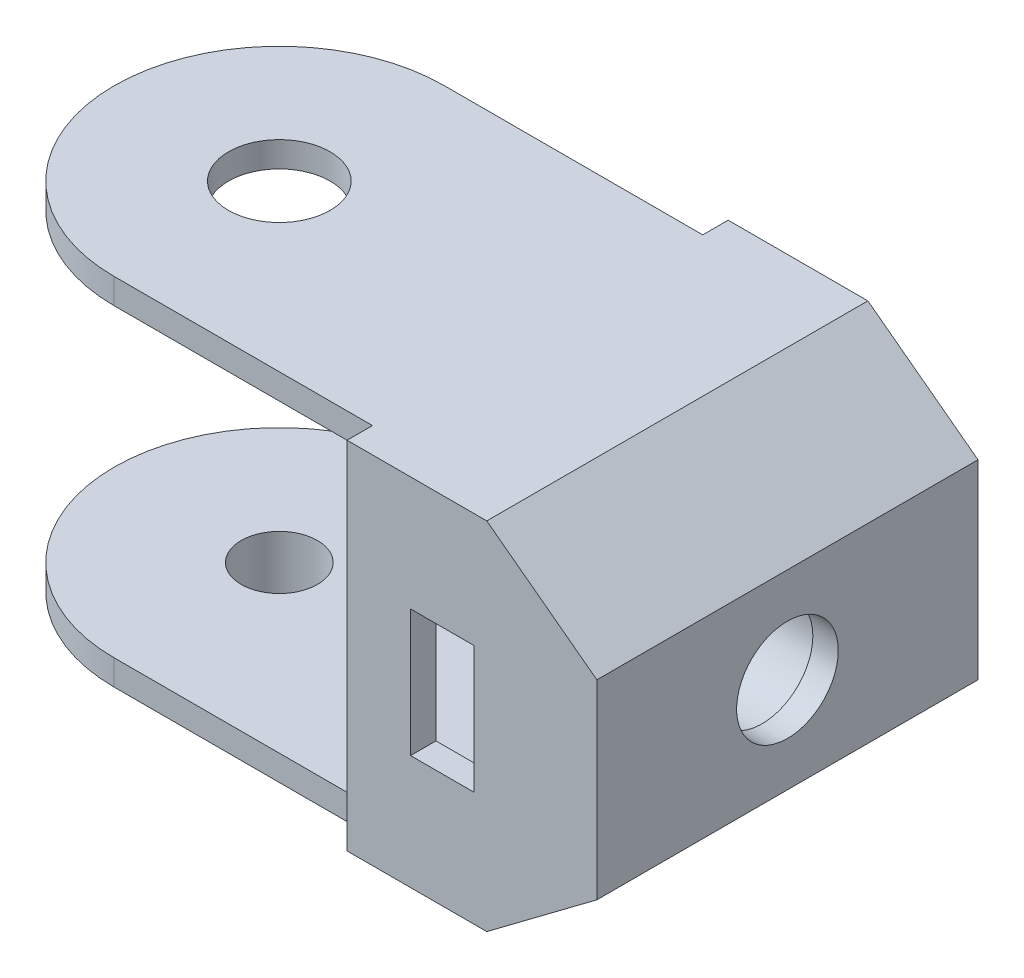
ISO-10303-21;
HEADER;
FILE_DESCRIPTION(('STEP AP214'),'2;1');
FILE_NAME('part.step','',(''),(''),'','','');
FILE_SCHEMA(('AUTOMOTIVE_DESIGN { 1 0 10303 214 1 1 1 1 }'));
ENDSEC;
DATA;
#1=APPLICATION_CONTEXT('core data for automotive mechanical design processes');
#2=APPLICATION_PROTOCOL_DEFINITION('international standard','automotive_design',2000,#1);
#3=PRODUCT_CONTEXT('',#1,'mechanical');
#4=PRODUCT('Part','Part','',(#3));
#5=PRODUCT_RELATED_PRODUCT_CATEGORY('part','',(#4));
#6=PRODUCT_DEFINITION_FORMATION('','',#4);
#7=PRODUCT_DEFINITION_CONTEXT('part definition',#1,'design');
#8=PRODUCT_DEFINITION('design','',#6,#7);
#9=PRODUCT_DEFINITION_SHAPE('','',#8);
#10=(LENGTH_UNIT() NAMED_UNIT(*) SI_UNIT(.MILLI.,.METRE.));
#11=(NAMED_UNIT(*) PLANE_ANGLE_UNIT() SI_UNIT($,.RADIAN.));
#12=(NAMED_UNIT(*) SI_UNIT($,.STERADIAN.) SOLID_ANGLE_UNIT());
#13=UNCERTAINTY_MEASURE_WITH_UNIT(LENGTH_MEASURE(1.E-05),#10,'distance_accuracy_value','');
#14=(GEOMETRIC_REPRESENTATION_CONTEXT(3) GLOBAL_UNCERTAINTY_ASSIGNED_CONTEXT((#13)) GLOBAL_UNIT_ASSIGNED_CONTEXT((#10,
#11,#12)) REPRESENTATION_CONTEXT('',''));
#15=CARTESIAN_POINT('',(0.,0.,0.));
#16=DIRECTION('',(0.,0.,1.));
#17=DIRECTION('',(1.,0.,0.));
#18=AXIS2_PLACEMENT_3D('',#15,#16,#17);
#19=CARTESIAN_POINT('',(0.,0.,0.));
#20=DIRECTION('',(0.,1.,0.));
#21=DIRECTION('',(0.,0.,1.));
#22=AXIS2_PLACEMENT_3D('',#19,#20,#21);
#23=PLANE('',#22);
#24=DIRECTION('',(-1.,0.,0.));
#25=VECTOR('',#24,1.);
#26=CARTESIAN_POINT('',(40.,0.,-13.));
#27=LINE('',#26,#25);
#28=CARTESIAN_POINT('',(20.3333333333333,0.,-13.));
#29=VERTEX_POINT('',#28);
#30=CARTESIAN_POINT('',(0.,0.,-13.));
#31=VERTEX_POINT('',#30);
#32=EDGE_CURVE('E444',#29,#31,#27,.T.);
#33=ORIENTED_EDGE('',*,*,#32,.F.);
#34=DIRECTION('',(0.,0.,1.));
#35=VECTOR('',#34,1.);
#36=CARTESIAN_POINT('',(20.3333333333333,0.,-15.));
#37=LINE('',#36,#35);
#38=CARTESIAN_POINT('',(20.3333333333333,0.,-15.));
#39=VERTEX_POINT('',#38);
#40=EDGE_CURVE('E342',#39,#29,#37,.T.);
#41=ORIENTED_EDGE('',*,*,#40,.F.);
#42=DIRECTION('',(1.,0.,0.));
#43=VECTOR('',#42,1.);
#44=CARTESIAN_POINT('',(20.3333333333333,0.,-15.));
#45=LINE('',#44,#43);
#46=CARTESIAN_POINT('',(31.3333333333333,0.,-15.));
#47=VERTEX_POINT('',#46);
#48=EDGE_CURVE('E325',#39,#47,#45,.T.);
#49=ORIENTED_EDGE('',*,*,#48,.T.);
#50=DIRECTION('',(0.,0.,1.));
#51=VECTOR('',#50,1.);
#52=CARTESIAN_POINT('',(31.3333333333333,0.,-23.8333333333333));
#53=LINE('',#52,#51);
#54=CARTESIAN_POINT('',(31.3333333333333,0.,15.));
#55=VERTEX_POINT('',#54);
#56=EDGE_CURVE('E381',#47,#55,#53,.T.);
#57=ORIENTED_EDGE('',*,*,#56,.T.);
#58=DIRECTION('',(1.,0.,0.));
#59=VECTOR('',#58,1.);
#60=CARTESIAN_POINT('',(20.3333333333333,0.,15.));
#61=LINE('',#60,#59);
#62=CARTESIAN_POINT('',(20.3333333333333,0.,15.));
#63=VERTEX_POINT('',#62);
#64=EDGE_CURVE('E357',#63,#55,#61,.T.);
#65=ORIENTED_EDGE('',*,*,#64,.F.);
#66=DIRECTION('',(0.,0.,-1.));
#67=VECTOR('',#66,1.);
#68=CARTESIAN_POINT('',(20.3333333333333,0.,15.));
#69=LINE('',#68,#67);
#70=CARTESIAN_POINT('',(20.3333333333333,0.,13.));
#71=VERTEX_POINT('',#70);
#72=EDGE_CURVE('E363',#63,#71,#69,.T.);
#73=ORIENTED_EDGE('',*,*,#72,.T.);
#74=DIRECTION('',(1.,0.,0.));
#75=VECTOR('',#74,1.);
#76=CARTESIAN_POINT('',(40.,0.,13.));
#77=LINE('',#76,#75);
#78=CARTESIAN_POINT('',(0.,0.,13.));
#79=VERTEX_POINT('',#78);
#80=EDGE_CURVE('E458',#79,#71,#77,.T.);
#81=ORIENTED_EDGE('',*,*,#80,.F.);
#82=CARTESIAN_POINT('',(0.,0.,0.));
#83=DIRECTION('',(0.,1.,0.));
#84=DIRECTION('',(0.,0.,1.));
#85=AXIS2_PLACEMENT_3D('',#82,#83,#84);
#86=CIRCLE('',#85,13.);
#87=EDGE_CURVE('E456',#31,#79,#86,.T.);
#88=ORIENTED_EDGE('',*,*,#87,.F.);
#89=EDGE_LOOP('',(#33,#41,#49,#57,#65,#73,#81,#88));
#90=FACE_BOUND('',#89,.T.);
#91=CARTESIAN_POINT('',(0.,0.,0.));
#92=DIRECTION('',(0.,1.,0.));
#93=DIRECTION('',(0.,0.,1.));
#94=AXIS2_PLACEMENT_3D('',#91,#92,#93);
#95=CIRCLE('',#94,4.);
#96=CARTESIAN_POINT('',(0.,0.,4.));
#97=VERTEX_POINT('',#96);
#98=EDGE_CURVE('E11',#97,#97,#95,.F.);
#99=ORIENTED_EDGE('',*,*,#98,.F.);
#100=EDGE_LOOP('',(#99));
#101=FACE_BOUND('',#100,.T.);
#102=ADVANCED_FACE('F33',(#90,#101),#23,.F.);
#103=CARTESIAN_POINT('',(38.,26.,-13.));
#104=DIRECTION('',(1.,0.,0.));
#105=DIRECTION('',(0.,0.,-1.));
#106=AXIS2_PLACEMENT_3D('',#103,#104,#105);
#107=PLANE('',#106);
#108=CARTESIAN_POINT('',(38.,14.,0.));
#109=DIRECTION('',(-1.,0.,0.));
#110=DIRECTION('',(0.,0.,1.));
#111=AXIS2_PLACEMENT_3D('',#108,#109,#110);
#112=CIRCLE('',#111,7.51501334518288);
#113=CARTESIAN_POINT('',(38.,7.,2.73412245122206));
#114=VERTEX_POINT('',#113);
#115=CARTESIAN_POINT('',(38.,21.,2.73412245122217));
#116=VERTEX_POINT('',#115);
#117=EDGE_CURVE('E306',#114,#116,#112,.T.);
#118=ORIENTED_EDGE('',*,*,#117,.F.);
#119=DIRECTION('',(0.,0.,1.));
#120=VECTOR('',#119,1.);
#121=CARTESIAN_POINT('',(38.,7.,-13.));
#122=LINE('',#121,#120);
#123=CARTESIAN_POINT('',(38.,7.00000000000001,13.));
#124=VERTEX_POINT('',#123);
#125=EDGE_CURVE('E389',#114,#124,#122,.T.);
#126=ORIENTED_EDGE('',*,*,#125,.T.);
#127=DIRECTION('',(0.,-1.,0.));
#128=VECTOR('',#127,1.);
#129=CARTESIAN_POINT('',(38.,26.,13.));
#130=LINE('',#129,#128);
#131=CARTESIAN_POINT('',(38.,21.,13.));
#132=VERTEX_POINT('',#131);
#133=EDGE_CURVE('E439',#132,#124,#130,.T.);
#134=ORIENTED_EDGE('',*,*,#133,.F.);
#135=DIRECTION('',(0.,0.,-1.));
#136=VECTOR('',#135,1.);
#137=CARTESIAN_POINT('',(38.,21.,-13.));
#138=LINE('',#137,#136);
#139=EDGE_CURVE('E408',#132,#116,#138,.T.);
#140=ORIENTED_EDGE('',*,*,#139,.T.);
#141=EDGE_LOOP('',(#118,#126,#134,#140));
#142=FACE_BOUND('',#141,.T.);
#143=ADVANCED_FACE('F491',(#142),#107,.F.);
#144=CARTESIAN_POINT('',(38.,14.,0.));
#145=DIRECTION('',(1.,0.,0.));
#146=DIRECTION('',(0.,0.,-1.));
#147=AXIS2_PLACEMENT_3D('',#144,#145,#146);
#148=CIRCLE('',#147,4.);
#149=CARTESIAN_POINT('',(38.,14.,-4.));
#150=VERTEX_POINT('',#149);
#151=EDGE_CURVE('E412',#150,#150,#148,.T.);
#152=ORIENTED_EDGE('',*,*,#151,.T.);
#153=EDGE_LOOP('',(#152));
#154=FACE_BOUND('',#153,.T.);
#155=CARTESIAN_POINT('',(38.,14.,0.));
#156=DIRECTION('',(-1.,0.,0.));
#157=DIRECTION('',(0.,0.,1.));
#158=AXIS2_PLACEMENT_3D('',#155,#156,#157);
#159=CIRCLE('',#158,4.48835620975431);
#160=CARTESIAN_POINT('',(38.,14.,4.48835620975432));
#161=VERTEX_POINT('',#160);
#162=EDGE_CURVE('E302',#161,#161,#159,.T.);
#163=ORIENTED_EDGE('',*,*,#162,.T.);
#164=EDGE_LOOP('',(#163));
#165=FACE_BOUND('',#164,.T.);
#166=ADVANCED_FACE('F513',(#154,#165),#107,.F.);
#167=CARTESIAN_POINT('',(40.,2.,-13.));
#168=DIRECTION('',(0.,0.,1.));
#169=DIRECTION('',(1.,0.,0.));
#170=AXIS2_PLACEMENT_3D('',#167,#168,#169);
#171=PLANE('',#170);
#172=DIRECTION('',(-1.,0.,0.));
#173=VECTOR('',#172,1.);
#174=CARTESIAN_POINT('',(40.,28.,-13.));
#175=LINE('',#174,#173);
#176=CARTESIAN_POINT('',(20.3333333333333,28.,-13.));
#177=VERTEX_POINT('',#176);
#178=CARTESIAN_POINT('',(0.,28.,-13.));
#179=VERTEX_POINT('',#178);
#180=EDGE_CURVE('E418',#177,#179,#175,.T.);
#181=ORIENTED_EDGE('',*,*,#180,.F.);
#182=DIRECTION('',(0.,-1.,0.));
#183=VECTOR('',#182,1.);
#184=CARTESIAN_POINT('',(20.3333333333333,28.,-13.));
#185=LINE('',#184,#183);
#186=CARTESIAN_POINT('',(20.3333333333333,26.,-13.));
#187=VERTEX_POINT('',#186);
#188=EDGE_CURVE('E322',#177,#187,#185,.T.);
#189=ORIENTED_EDGE('',*,*,#188,.T.);
#190=DIRECTION('',(-1.,0.,0.));
#191=VECTOR('',#190,1.);
#192=CARTESIAN_POINT('',(40.,26.,-13.));
#193=LINE('',#192,#191);
#194=CARTESIAN_POINT('',(0.,26.,-13.));
#195=VERTEX_POINT('',#194);
#196=EDGE_CURVE('E415',#187,#195,#193,.T.);
#197=ORIENTED_EDGE('',*,*,#196,.T.);
#198=DIRECTION('',(0.,-1.,0.));
#199=VECTOR('',#198,1.);
#200=CARTESIAN_POINT('',(0.,28.,-13.));
#201=LINE('',#200,#199);
#202=EDGE_CURVE('E436',#179,#195,#201,.T.);
#203=ORIENTED_EDGE('',*,*,#202,.F.);
#204=EDGE_LOOP('',(#181,#189,#197,#203));
#205=FACE_BOUND('',#204,.T.);
#206=ADVANCED_FACE('F515',(#205),#171,.F.);
#207=CARTESIAN_POINT('',(40.,2.,13.));
#208=DIRECTION('',(0.,0.,-1.));
#209=DIRECTION('',(-1.,0.,0.));
#210=AXIS2_PLACEMENT_3D('',#207,#208,#209);
#211=PLANE('',#210);
#212=DIRECTION('',(0.,-1.,0.));
#213=VECTOR('',#212,1.);
#214=CARTESIAN_POINT('',(20.3333333333333,28.,13.));
#215=LINE('',#214,#213);
#216=CARTESIAN_POINT('',(20.3333333333333,28.,13.));
#217=VERTEX_POINT('',#216);
#218=CARTESIAN_POINT('',(20.3333333333333,26.,13.));
#219=VERTEX_POINT('',#218);
#220=EDGE_CURVE('E350',#217,#219,#215,.T.);
#221=ORIENTED_EDGE('',*,*,#220,.F.);
#222=DIRECTION('',(1.,0.,0.));
#223=VECTOR('',#222,1.);
#224=CARTESIAN_POINT('',(40.,28.,13.));
#225=LINE('',#224,#223);
#226=CARTESIAN_POINT('',(0.,28.,13.));
#227=VERTEX_POINT('',#226);
#228=EDGE_CURVE('E423',#227,#217,#225,.T.);
#229=ORIENTED_EDGE('',*,*,#228,.F.);
#230=DIRECTION('',(0.,-1.,0.));
#231=VECTOR('',#230,1.);
#232=CARTESIAN_POINT('',(0.,28.,13.));
#233=LINE('',#232,#231);
#234=CARTESIAN_POINT('',(0.,26.,13.));
#235=VERTEX_POINT('',#234);
#236=EDGE_CURVE('E426',#227,#235,#233,.T.);
#237=ORIENTED_EDGE('',*,*,#236,.T.);
#238=DIRECTION('',(1.,0.,0.));
#239=VECTOR('',#238,1.);
#240=CARTESIAN_POINT('',(40.,26.,13.));
#241=LINE('',#240,#239);
#242=EDGE_CURVE('E421',#235,#219,#241,.T.);
#243=ORIENTED_EDGE('',*,*,#242,.T.);
#244=EDGE_LOOP('',(#221,#229,#237,#243));
#245=FACE_BOUND('',#244,.T.);
#246=ADVANCED_FACE('F522',(#245),#211,.F.);
#247=CARTESIAN_POINT('',(20.3333333333333,2.,13.));
#248=VERTEX_POINT('',#247);
#249=EDGE_CURVE('E345',#248,#71,#215,.T.);
#250=ORIENTED_EDGE('',*,*,#249,.F.);
#251=DIRECTION('',(1.,0.,0.));
#252=VECTOR('',#251,1.);
#253=CARTESIAN_POINT('',(40.,2.,13.));
#254=LINE('',#253,#252);
#255=CARTESIAN_POINT('',(0.,2.,13.));
#256=VERTEX_POINT('',#255);
#257=EDGE_CURVE('E451',#256,#248,#254,.T.);
#258=ORIENTED_EDGE('',*,*,#257,.F.);
#259=DIRECTION('',(0.,-1.,0.));
#260=VECTOR('',#259,1.);
#261=CARTESIAN_POINT('',(0.,2.,13.));
#262=LINE('',#261,#260);
#263=EDGE_CURVE('E454',#256,#79,#262,.T.);
#264=ORIENTED_EDGE('',*,*,#263,.T.);
#265=ORIENTED_EDGE('',*,*,#80,.T.);
#266=EDGE_LOOP('',(#250,#258,#264,#265));
#267=FACE_BOUND('',#266,.T.);
#268=ADVANCED_FACE('F529',(#267),#211,.F.);
#269=CARTESIAN_POINT('',(38.,21.,-2.73412245122214));
#270=VERTEX_POINT('',#269);
#271=CARTESIAN_POINT('',(38.,7.,-2.73412245122203));
#272=VERTEX_POINT('',#271);
#273=EDGE_CURVE('E313',#270,#272,#112,.T.);
#274=ORIENTED_EDGE('',*,*,#273,.F.);
#275=CARTESIAN_POINT('',(38.,21.,-13.));
#276=VERTEX_POINT('',#275);
#277=EDGE_CURVE('E402',#270,#276,#138,.T.);
#278=ORIENTED_EDGE('',*,*,#277,.T.);
#279=DIRECTION('',(0.,-1.,0.));
#280=VECTOR('',#279,1.);
#281=CARTESIAN_POINT('',(38.,26.,-13.));
#282=LINE('',#281,#280);
#283=CARTESIAN_POINT('',(38.,7.00000000000001,-13.));
#284=VERTEX_POINT('',#283);
#285=EDGE_CURVE('E442',#276,#284,#282,.T.);
#286=ORIENTED_EDGE('',*,*,#285,.T.);
#287=EDGE_CURVE('E395',#284,#272,#122,.T.);
#288=ORIENTED_EDGE('',*,*,#287,.T.);
#289=EDGE_LOOP('',(#274,#278,#286,#288));
#290=FACE_BOUND('',#289,.T.);
#291=ADVANCED_FACE('F475',(#290),#107,.F.);
#292=CARTESIAN_POINT('',(0.,26.,0.));
#293=DIRECTION('',(0.,1.,0.));
#294=DIRECTION('',(0.,0.,1.));
#295=AXIS2_PLACEMENT_3D('',#292,#293,#294);
#296=PLANE('',#295);
#297=CARTESIAN_POINT('',(0.,26.,0.));
#298=DIRECTION('',(0.,1.,0.));
#299=DIRECTION('',(0.,0.,1.));
#300=AXIS2_PLACEMENT_3D('',#297,#298,#299);
#301=CIRCLE('',#300,4.);
#302=CARTESIAN_POINT('',(0.,26.,4.));
#303=VERTEX_POINT('',#302);
#304=EDGE_CURVE('E296',#303,#303,#301,.T.);
#305=ORIENTED_EDGE('',*,*,#304,.T.);
#306=EDGE_LOOP('',(#305));
#307=FACE_BOUND('',#306,.T.);
#308=CARTESIAN_POINT('',(31.3333333333333,26.,-13.));
#309=VERTEX_POINT('',#308);
#310=EDGE_CURVE('E427',#309,#187,#193,.T.);
#311=ORIENTED_EDGE('',*,*,#310,.F.);
#312=DIRECTION('',(0.,0.,1.));
#313=VECTOR('',#312,1.);
#314=CARTESIAN_POINT('',(31.3333333333333,26.,-25.1392384897534));
#315=LINE('',#314,#313);
#316=CARTESIAN_POINT('',(31.3333333333333,26.,13.));
#317=VERTEX_POINT('',#316);
#318=EDGE_CURVE('E403',#309,#317,#315,.T.);
#319=ORIENTED_EDGE('',*,*,#318,.T.);
#320=DIRECTION('',(1.,0.,0.));
#321=VECTOR('',#320,1.);
#322=CARTESIAN_POINT('',(0.,26.,13.));
#323=LINE('',#322,#321);
#324=EDGE_CURVE('E374',#219,#317,#323,.T.);
#325=ORIENTED_EDGE('',*,*,#324,.F.);
#326=ORIENTED_EDGE('',*,*,#242,.F.);
#327=CARTESIAN_POINT('',(0.,26.,0.));
#328=DIRECTION('',(0.,1.,0.));
#329=DIRECTION('',(0.,0.,1.));
#330=AXIS2_PLACEMENT_3D('',#327,#328,#329);
#331=CIRCLE('',#330,13.);
#332=EDGE_CURVE('E430',#195,#235,#331,.T.);
#333=ORIENTED_EDGE('',*,*,#332,.F.);
#334=ORIENTED_EDGE('',*,*,#196,.F.);
#335=EDGE_LOOP('',(#311,#319,#325,#326,#333,#334));
#336=FACE_BOUND('',#335,.T.);
#337=ADVANCED_FACE('F528',(#307,#336),#296,.F.);
#338=CARTESIAN_POINT('',(40.,2.,-13.));
#339=DIRECTION('',(-1.,0.,0.));
#340=DIRECTION('',(0.,0.,1.));
#341=AXIS2_PLACEMENT_3D('',#338,#339,#340);
#342=PLANE('',#341);
#343=DIRECTION('',(0.,0.,1.));
#344=VECTOR('',#343,1.);
#345=CARTESIAN_POINT('',(40.,21.5,-23.8333333333333));
#346=LINE('',#345,#344);
#347=CARTESIAN_POINT('',(40.,21.5,-15.));
#348=VERTEX_POINT('',#347);
#349=CARTESIAN_POINT('',(40.,21.5,15.));
#350=VERTEX_POINT('',#349);
#351=EDGE_CURVE('E383',#348,#350,#346,.T.);
#352=ORIENTED_EDGE('',*,*,#351,.T.);
#353=DIRECTION('',(0.,1.,0.));
#354=VECTOR('',#353,1.);
#355=CARTESIAN_POINT('',(40.,6.5,15.));
#356=LINE('',#355,#354);
#357=CARTESIAN_POINT('',(40.,6.5,15.));
#358=VERTEX_POINT('',#357);
#359=EDGE_CURVE('E346',#358,#350,#356,.T.);
#360=ORIENTED_EDGE('',*,*,#359,.F.);
#361=DIRECTION('',(0.,0.,1.));
#362=VECTOR('',#361,1.);
#363=CARTESIAN_POINT('',(40.,6.5,-23.8333333333333));
#364=LINE('',#363,#362);
#365=CARTESIAN_POINT('',(40.,6.5,-15.));
#366=VERTEX_POINT('',#365);
#367=EDGE_CURVE('E378',#366,#358,#364,.T.);
#368=ORIENTED_EDGE('',*,*,#367,.F.);
#369=DIRECTION('',(0.,1.,0.));
#370=VECTOR('',#369,1.);
#371=CARTESIAN_POINT('',(40.,6.5,-15.));
#372=LINE('',#371,#370);
#373=EDGE_CURVE('E318',#366,#348,#372,.T.);
#374=ORIENTED_EDGE('',*,*,#373,.T.);
#375=EDGE_LOOP('',(#352,#360,#368,#374));
#376=FACE_BOUND('',#375,.T.);
#377=CARTESIAN_POINT('',(40.,14.,0.));
#378=DIRECTION('',(1.,0.,0.));
#379=DIRECTION('',(0.,0.,-1.));
#380=AXIS2_PLACEMENT_3D('',#377,#378,#379);
#381=CIRCLE('',#380,4.);
#382=CARTESIAN_POINT('',(40.,14.,-4.));
#383=VERTEX_POINT('',#382);
#384=EDGE_CURVE('E411',#383,#383,#381,.T.);
#385=ORIENTED_EDGE('',*,*,#384,.F.);
#386=EDGE_LOOP('',(#385));
#387=FACE_BOUND('',#386,.T.);
#388=ADVANCED_FACE('F35',(#376,#387),#342,.F.);
#389=DIRECTION('',(-1.,0.,0.));
#390=VECTOR('',#389,1.);
#391=CARTESIAN_POINT('',(40.,2.,-13.));
#392=LINE('',#391,#390);
#393=CARTESIAN_POINT('',(20.3333333333333,2.,-13.));
#394=VERTEX_POINT('',#393);
#395=CARTESIAN_POINT('',(0.,2.,-13.));
#396=VERTEX_POINT('',#395);
#397=EDGE_CURVE('E449',#394,#396,#392,.T.);
#398=ORIENTED_EDGE('',*,*,#397,.F.);
#399=EDGE_CURVE('E317',#394,#29,#185,.T.);
#400=ORIENTED_EDGE('',*,*,#399,.T.);
#401=ORIENTED_EDGE('',*,*,#32,.T.);
#402=DIRECTION('',(0.,-1.,0.));
#403=VECTOR('',#402,1.);
#404=CARTESIAN_POINT('',(0.,2.,-13.));
#405=LINE('',#404,#403);
#406=EDGE_CURVE('E462',#396,#31,#405,.T.);
#407=ORIENTED_EDGE('',*,*,#406,.F.);
#408=EDGE_LOOP('',(#398,#400,#401,#407));
#409=FACE_BOUND('',#408,.T.);
#410=ADVANCED_FACE('F524',(#409),#171,.F.);
#411=CARTESIAN_POINT('',(0.,2.,0.));
#412=DIRECTION('',(0.,-1.,0.));
#413=DIRECTION('',(0.,0.,-1.));
#414=AXIS2_PLACEMENT_3D('',#411,#412,#413);
#415=CYLINDRICAL_SURFACE('',#414,13.);
#416=ORIENTED_EDGE('',*,*,#87,.T.);
#417=ORIENTED_EDGE('',*,*,#263,.F.);
#418=CARTESIAN_POINT('',(0.,2.,0.));
#419=DIRECTION('',(0.,1.,0.));
#420=DIRECTION('',(0.,0.,1.));
#421=AXIS2_PLACEMENT_3D('',#418,#419,#420);
#422=CIRCLE('',#421,13.);
#423=EDGE_CURVE('E448',#396,#256,#422,.T.);
#424=ORIENTED_EDGE('',*,*,#423,.F.);
#425=ORIENTED_EDGE('',*,*,#406,.T.);
#426=EDGE_LOOP('',(#416,#417,#424,#425));
#427=FACE_BOUND('',#426,.T.);
#428=ADVANCED_FACE('F542',(#427),#415,.T.);
#429=CARTESIAN_POINT('',(0.,2.,0.));
#430=DIRECTION('',(0.,1.,0.));
#431=DIRECTION('',(0.,0.,1.));
#432=AXIS2_PLACEMENT_3D('',#429,#430,#431);
#433=PLANE('',#432);
#434=CARTESIAN_POINT('',(0.,2.,0.));
#435=DIRECTION('',(0.,1.,0.));
#436=DIRECTION('',(0.,0.,1.));
#437=AXIS2_PLACEMENT_3D('',#434,#435,#436);
#438=CIRCLE('',#437,3.);
#439=CARTESIAN_POINT('',(0.,2.,3.));
#440=VERTEX_POINT('',#439);
#441=EDGE_CURVE('E299',#440,#440,#438,.T.);
#442=ORIENTED_EDGE('',*,*,#441,.F.);
#443=EDGE_LOOP('',(#442));
#444=FACE_BOUND('',#443,.T.);
#445=DIRECTION('',(0.,0.,1.));
#446=VECTOR('',#445,1.);
#447=CARTESIAN_POINT('',(31.3333333333333,2.,-25.1392384897534));
#448=LINE('',#447,#446);
#449=CARTESIAN_POINT('',(31.3333333333333,2.,-13.));
#450=VERTEX_POINT('',#449);
#451=CARTESIAN_POINT('',(31.3333333333333,2.,13.));
#452=VERTEX_POINT('',#451);
#453=EDGE_CURVE('E390',#450,#452,#448,.T.);
#454=ORIENTED_EDGE('',*,*,#453,.F.);
#455=EDGE_CURVE('E445',#450,#394,#392,.T.);
#456=ORIENTED_EDGE('',*,*,#455,.T.);
#457=ORIENTED_EDGE('',*,*,#397,.T.);
#458=ORIENTED_EDGE('',*,*,#423,.T.);
#459=ORIENTED_EDGE('',*,*,#257,.T.);
#460=DIRECTION('',(1.,0.,0.));
#461=VECTOR('',#460,1.);
#462=CARTESIAN_POINT('',(0.,2.,13.));
#463=LINE('',#462,#461);
#464=EDGE_CURVE('E372',#248,#452,#463,.T.);
#465=ORIENTED_EDGE('',*,*,#464,.T.);
#466=EDGE_LOOP('',(#454,#456,#457,#458,#459,#465));
#467=FACE_BOUND('',#466,.T.);
#468=ADVANCED_FACE('F538',(#444,#467),#433,.T.);
#469=CARTESIAN_POINT('',(0.,28.,0.));
#470=DIRECTION('',(0.,-1.,0.));
#471=DIRECTION('',(0.,0.,-1.));
#472=AXIS2_PLACEMENT_3D('',#469,#470,#471);
#473=CYLINDRICAL_SURFACE('',#472,13.);
#474=ORIENTED_EDGE('',*,*,#332,.T.);
#475=ORIENTED_EDGE('',*,*,#236,.F.);
#476=CARTESIAN_POINT('',(0.,28.,0.));
#477=DIRECTION('',(0.,1.,0.));
#478=DIRECTION('',(0.,0.,1.));
#479=AXIS2_PLACEMENT_3D('',#476,#477,#478);
#480=CIRCLE('',#479,13.);
#481=EDGE_CURVE('E420',#179,#227,#480,.T.);
#482=ORIENTED_EDGE('',*,*,#481,.F.);
#483=ORIENTED_EDGE('',*,*,#202,.T.);
#484=EDGE_LOOP('',(#474,#475,#482,#483));
#485=FACE_BOUND('',#484,.T.);
#486=ADVANCED_FACE('F566',(#485),#473,.T.);
#487=CARTESIAN_POINT('',(0.,28.,0.));
#488=DIRECTION('',(0.,1.,0.));
#489=DIRECTION('',(0.,0.,1.));
#490=AXIS2_PLACEMENT_3D('',#487,#488,#489);
#491=PLANE('',#490);
#492=CARTESIAN_POINT('',(0.,28.,0.));
#493=DIRECTION('',(0.,1.,0.));
#494=DIRECTION('',(0.,0.,1.));
#495=AXIS2_PLACEMENT_3D('',#492,#493,#494);
#496=CIRCLE('',#495,4.);
#497=CARTESIAN_POINT('',(0.,28.,4.));
#498=VERTEX_POINT('',#497);
#499=EDGE_CURVE('E293',#498,#498,#496,.T.);
#500=ORIENTED_EDGE('',*,*,#499,.F.);
#501=EDGE_LOOP('',(#500));
#502=FACE_BOUND('',#501,.T.);
#503=DIRECTION('',(0.,0.,1.));
#504=VECTOR('',#503,1.);
#505=CARTESIAN_POINT('',(31.3333333333333,28.,-23.8333333333333));
#506=LINE('',#505,#504);
#507=CARTESIAN_POINT('',(31.3333333333333,28.,-15.));
#508=VERTEX_POINT('',#507);
#509=CARTESIAN_POINT('',(31.3333333333333,28.,15.));
#510=VERTEX_POINT('',#509);
#511=EDGE_CURVE('E377',#508,#510,#506,.T.);
#512=ORIENTED_EDGE('',*,*,#511,.F.);
#513=DIRECTION('',(-1.,0.,0.));
#514=VECTOR('',#513,1.);
#515=CARTESIAN_POINT('',(31.3333333333333,28.,-15.));
#516=LINE('',#515,#514);
#517=CARTESIAN_POINT('',(20.3333333333333,28.,-15.));
#518=VERTEX_POINT('',#517);
#519=EDGE_CURVE('E331',#508,#518,#516,.T.);
#520=ORIENTED_EDGE('',*,*,#519,.T.);
#521=DIRECTION('',(0.,0.,1.));
#522=VECTOR('',#521,1.);
#523=CARTESIAN_POINT('',(20.3333333333333,28.,-15.));
#524=LINE('',#523,#522);
#525=EDGE_CURVE('E337',#518,#177,#524,.T.);
#526=ORIENTED_EDGE('',*,*,#525,.T.);
#527=ORIENTED_EDGE('',*,*,#180,.T.);
#528=ORIENTED_EDGE('',*,*,#481,.T.);
#529=ORIENTED_EDGE('',*,*,#228,.T.);
#530=DIRECTION('',(0.,0.,-1.));
#531=VECTOR('',#530,1.);
#532=CARTESIAN_POINT('',(20.3333333333333,28.,15.));
#533=LINE('',#532,#531);
#534=CARTESIAN_POINT('',(20.3333333333333,28.,15.));
#535=VERTEX_POINT('',#534);
#536=EDGE_CURVE('E369',#535,#217,#533,.T.);
#537=ORIENTED_EDGE('',*,*,#536,.F.);
#538=DIRECTION('',(-1.,0.,0.));
#539=VECTOR('',#538,1.);
#540=CARTESIAN_POINT('',(31.3333333333333,28.,15.));
#541=LINE('',#540,#539);
#542=EDGE_CURVE('E353',#510,#535,#541,.T.);
#543=ORIENTED_EDGE('',*,*,#542,.F.);
#544=EDGE_LOOP('',(#512,#520,#526,#527,#528,#529,#537,#543));
#545=FACE_BOUND('',#544,.T.);
#546=ADVANCED_FACE('F570',(#502,#545),#491,.T.);
#547=CARTESIAN_POINT('',(38.,14.,0.));
#548=DIRECTION('',(1.,0.,0.));
#549=DIRECTION('',(0.,0.,-1.));
#550=AXIS2_PLACEMENT_3D('',#547,#548,#549);
#551=CYLINDRICAL_SURFACE('',#550,4.);
#552=ORIENTED_EDGE('',*,*,#151,.F.);
#553=EDGE_LOOP('',(#552));
#554=FACE_BOUND('',#553,.T.);
#555=ORIENTED_EDGE('',*,*,#384,.T.);
#556=EDGE_LOOP('',(#555));
#557=FACE_BOUND('',#556,.T.);
#558=ADVANCED_FACE('F602',(#554,#557),#551,.F.);
#559=CARTESIAN_POINT('',(31.3333333333333,26.,-25.1392384897534));
#560=DIRECTION('',(-0.6,-0.8,0.));
#561=DIRECTION('',(0.8,-0.6,0.));
#562=AXIS2_PLACEMENT_3D('',#559,#560,#561);
#563=PLANE('',#562);
#564=ORIENTED_EDGE('',*,*,#277,.F.);
#565=CARTESIAN_POINT('',(47.3333333333333,14.,0.));
#566=DIRECTION('',(-0.6,-0.8,0.));
#567=DIRECTION('',(0.8,-0.6,0.));
#568=AXIS2_PLACEMENT_3D('',#565,#566,#567);
#569=ELLIPSE('',#568,12.5250222419715,7.51501334518288);
#570=EDGE_CURVE('E312',#270,#116,#569,.F.);
#571=ORIENTED_EDGE('',*,*,#570,.T.);
#572=ORIENTED_EDGE('',*,*,#139,.F.);
#573=DIRECTION('',(0.8,-0.6,0.));
#574=VECTOR('',#573,1.);
#575=CARTESIAN_POINT('',(31.3333333333333,26.,13.));
#576=LINE('',#575,#574);
#577=EDGE_CURVE('E398',#317,#132,#576,.T.);
#578=ORIENTED_EDGE('',*,*,#577,.F.);
#579=ORIENTED_EDGE('',*,*,#318,.F.);
#580=DIRECTION('',(-0.8,0.6,0.));
#581=VECTOR('',#580,1.);
#582=CARTESIAN_POINT('',(31.3333333333333,26.,-13.));
#583=LINE('',#582,#581);
#584=EDGE_CURVE('E399',#276,#309,#583,.T.);
#585=ORIENTED_EDGE('',*,*,#584,.F.);
#586=EDGE_LOOP('',(#564,#571,#572,#578,#579,#585));
#587=FACE_BOUND('',#586,.T.);
#588=ADVANCED_FACE('F493',(#587),#563,.T.);
#589=CARTESIAN_POINT('',(34.,26.,-25.1392384897534));
#590=DIRECTION('',(0.600000000000001,0.799999999999999,0.));
#591=DIRECTION('',(-0.799999999999999,0.600000000000001,0.));
#592=AXIS2_PLACEMENT_3D('',#589,#590,#591);
#593=PLANE('',#592);
#594=ORIENTED_EDGE('',*,*,#511,.T.);
#595=DIRECTION('',(-0.8,0.6,0.));
#596=VECTOR('',#595,1.);
#597=CARTESIAN_POINT('',(40.,21.5,15.));
#598=LINE('',#597,#596);
#599=EDGE_CURVE('E349',#350,#510,#598,.T.);
#600=ORIENTED_EDGE('',*,*,#599,.F.);
#601=ORIENTED_EDGE('',*,*,#351,.F.);
#602=DIRECTION('',(-0.8,0.6,0.));
#603=VECTOR('',#602,1.);
#604=CARTESIAN_POINT('',(40.,21.5,-15.));
#605=LINE('',#604,#603);
#606=EDGE_CURVE('E334',#348,#508,#605,.T.);
#607=ORIENTED_EDGE('',*,*,#606,.T.);
#608=EDGE_LOOP('',(#594,#600,#601,#607));
#609=FACE_BOUND('',#608,.T.);
#610=ADVANCED_FACE('F595',(#609),#593,.T.);
#611=CARTESIAN_POINT('',(31.3333333333333,2.,-25.1392384897534));
#612=DIRECTION('',(-0.6,0.8,0.));
#613=DIRECTION('',(-0.8,-0.6,0.));
#614=AXIS2_PLACEMENT_3D('',#611,#612,#613);
#615=PLANE('',#614);
#616=ORIENTED_EDGE('',*,*,#125,.F.);
#617=CARTESIAN_POINT('',(47.3333333333333,14.,0.));
#618=DIRECTION('',(-0.6,0.8,0.));
#619=DIRECTION('',(0.8,0.6,0.));
#620=AXIS2_PLACEMENT_3D('',#617,#618,#619);
#621=ELLIPSE('',#620,12.5250222419715,7.51501334518288);
#622=EDGE_CURVE('E41',#114,#272,#621,.F.);
#623=ORIENTED_EDGE('',*,*,#622,.T.);
#624=ORIENTED_EDGE('',*,*,#287,.F.);
#625=DIRECTION('',(0.8,0.6,0.));
#626=VECTOR('',#625,1.);
#627=CARTESIAN_POINT('',(31.3333333333333,2.,-13.));
#628=LINE('',#627,#626);
#629=EDGE_CURVE('E386',#450,#284,#628,.T.);
#630=ORIENTED_EDGE('',*,*,#629,.F.);
#631=ORIENTED_EDGE('',*,*,#453,.T.);
#632=DIRECTION('',(-0.8,-0.6,0.));
#633=VECTOR('',#632,1.);
#634=CARTESIAN_POINT('',(31.3333333333333,2.,13.));
#635=LINE('',#634,#633);
#636=EDGE_CURVE('E380',#124,#452,#635,.T.);
#637=ORIENTED_EDGE('',*,*,#636,.F.);
#638=EDGE_LOOP('',(#616,#623,#624,#630,#631,#637));
#639=FACE_BOUND('',#638,.T.);
#640=ADVANCED_FACE('F468',(#639),#615,.T.);
#641=CARTESIAN_POINT('',(38.,5.,-25.1392384897534));
#642=DIRECTION('',(0.6,-0.8,0.));
#643=DIRECTION('',(0.8,0.6,0.));
#644=AXIS2_PLACEMENT_3D('',#641,#642,#643);
#645=PLANE('',#644);
#646=ORIENTED_EDGE('',*,*,#56,.F.);
#647=DIRECTION('',(0.8,0.6,0.));
#648=VECTOR('',#647,1.);
#649=CARTESIAN_POINT('',(31.3333333333333,0.,-15.));
#650=LINE('',#649,#648);
#651=EDGE_CURVE('E321',#47,#366,#650,.T.);
#652=ORIENTED_EDGE('',*,*,#651,.T.);
#653=ORIENTED_EDGE('',*,*,#367,.T.);
#654=DIRECTION('',(0.8,0.6,0.));
#655=VECTOR('',#654,1.);
#656=CARTESIAN_POINT('',(31.3333333333333,0.,15.));
#657=LINE('',#656,#655);
#658=EDGE_CURVE('E360',#55,#358,#657,.T.);
#659=ORIENTED_EDGE('',*,*,#658,.F.);
#660=EDGE_LOOP('',(#646,#652,#653,#659));
#661=FACE_BOUND('',#660,.T.);
#662=ADVANCED_FACE('F597',(#661),#645,.T.);
#663=CARTESIAN_POINT('',(0.,0.,13.));
#664=DIRECTION('',(0.,0.,1.));
#665=DIRECTION('',(1.,0.,0.));
#666=AXIS2_PLACEMENT_3D('',#663,#664,#665);
#667=PLANE('',#666);
#668=DIRECTION('',(-1.,0.,0.));
#669=VECTOR('',#668,1.);
#670=CARTESIAN_POINT('',(0.,19.,13.));
#671=LINE('',#670,#669);
#672=CARTESIAN_POINT('',(30.3333333333333,19.,13.));
#673=VERTEX_POINT('',#672);
#674=CARTESIAN_POINT('',(25.3333333333333,19.,13.));
#675=VERTEX_POINT('',#674);
#676=EDGE_CURVE('E281',#673,#675,#671,.T.);
#677=ORIENTED_EDGE('',*,*,#676,.T.);
#678=DIRECTION('',(0.,-1.,0.));
#679=VECTOR('',#678,1.);
#680=CARTESIAN_POINT('',(25.3333333333333,0.,13.));
#681=LINE('',#680,#679);
#682=CARTESIAN_POINT('',(25.3333333333333,9.,13.));
#683=VERTEX_POINT('',#682);
#684=EDGE_CURVE('E284',#675,#683,#681,.T.);
#685=ORIENTED_EDGE('',*,*,#684,.T.);
#686=DIRECTION('',(1.,0.,0.));
#687=VECTOR('',#686,1.);
#688=CARTESIAN_POINT('',(0.,8.99999999999999,13.));
#689=LINE('',#688,#687);
#690=CARTESIAN_POINT('',(30.3333333333333,9.,13.));
#691=VERTEX_POINT('',#690);
#692=EDGE_CURVE('E269',#683,#691,#689,.T.);
#693=ORIENTED_EDGE('',*,*,#692,.T.);
#694=DIRECTION('',(0.,1.,0.));
#695=VECTOR('',#694,1.);
#696=CARTESIAN_POINT('',(30.3333333333333,0.,13.));
#697=LINE('',#696,#695);
#698=EDGE_CURVE('E278',#691,#673,#697,.T.);
#699=ORIENTED_EDGE('',*,*,#698,.T.);
#700=EDGE_LOOP('',(#677,#685,#693,#699));
#701=FACE_BOUND('',#700,.T.);
#702=EDGE_CURVE('E366',#219,#248,#215,.T.);
#703=ORIENTED_EDGE('',*,*,#702,.F.);
#704=ORIENTED_EDGE('',*,*,#324,.T.);
#705=ORIENTED_EDGE('',*,*,#577,.T.);
#706=ORIENTED_EDGE('',*,*,#133,.T.);
#707=ORIENTED_EDGE('',*,*,#636,.T.);
#708=ORIENTED_EDGE('',*,*,#464,.F.);
#709=EDGE_LOOP('',(#703,#704,#705,#706,#707,#708));
#710=FACE_BOUND('',#709,.T.);
#711=ADVANCED_FACE('F487',(#701,#710),#667,.F.);
#712=CARTESIAN_POINT('',(20.3333333333333,28.,15.));
#713=DIRECTION('',(1.,0.,0.));
#714=DIRECTION('',(0.,1.,0.));
#715=AXIS2_PLACEMENT_3D('',#712,#713,#714);
#716=PLANE('',#715);
#717=ORIENTED_EDGE('',*,*,#220,.T.);
#718=ORIENTED_EDGE('',*,*,#702,.T.);
#719=ORIENTED_EDGE('',*,*,#249,.T.);
#720=ORIENTED_EDGE('',*,*,#72,.F.);
#721=DIRECTION('',(0.,-1.,0.));
#722=VECTOR('',#721,1.);
#723=CARTESIAN_POINT('',(20.3333333333333,28.,15.));
#724=LINE('',#723,#722);
#725=EDGE_CURVE('E355',#535,#63,#724,.T.);
#726=ORIENTED_EDGE('',*,*,#725,.F.);
#727=ORIENTED_EDGE('',*,*,#536,.T.);
#728=EDGE_LOOP('',(#717,#718,#719,#720,#726,#727));
#729=FACE_BOUND('',#728,.T.);
#730=ADVANCED_FACE('F587',(#729),#716,.F.);
#731=CARTESIAN_POINT('',(0.,0.,15.));
#732=DIRECTION('',(0.,0.,1.));
#733=DIRECTION('',(1.,0.,0.));
#734=AXIS2_PLACEMENT_3D('',#731,#732,#733);
#735=PLANE('',#734);
#736=DIRECTION('',(0.,-1.,0.));
#737=VECTOR('',#736,1.);
#738=CARTESIAN_POINT('',(25.3333333333333,19.,15.));
#739=LINE('',#738,#737);
#740=CARTESIAN_POINT('',(25.3333333333333,19.,15.));
#741=VERTEX_POINT('',#740);
#742=CARTESIAN_POINT('',(25.3333333333333,9.,15.));
#743=VERTEX_POINT('',#742);
#744=EDGE_CURVE('E255',#741,#743,#739,.T.);
#745=ORIENTED_EDGE('',*,*,#744,.F.);
#746=DIRECTION('',(-1.,0.,0.));
#747=VECTOR('',#746,1.);
#748=CARTESIAN_POINT('',(25.3333333333333,19.,15.));
#749=LINE('',#748,#747);
#750=CARTESIAN_POINT('',(30.3333333333333,19.,15.));
#751=VERTEX_POINT('',#750);
#752=EDGE_CURVE('E263',#751,#741,#749,.T.);
#753=ORIENTED_EDGE('',*,*,#752,.F.);
#754=DIRECTION('',(0.,1.,0.));
#755=VECTOR('',#754,1.);
#756=CARTESIAN_POINT('',(30.3333333333333,19.,15.));
#757=LINE('',#756,#755);
#758=CARTESIAN_POINT('',(30.3333333333333,9.,15.));
#759=VERTEX_POINT('',#758);
#760=EDGE_CURVE('E260',#759,#751,#757,.T.);
#761=ORIENTED_EDGE('',*,*,#760,.F.);
#762=DIRECTION('',(1.,0.,0.));
#763=VECTOR('',#762,1.);
#764=CARTESIAN_POINT('',(25.3333333333333,9.,15.));
#765=LINE('',#764,#763);
#766=EDGE_CURVE('E257',#743,#759,#765,.T.);
#767=ORIENTED_EDGE('',*,*,#766,.F.);
#768=EDGE_LOOP('',(#745,#753,#761,#767));
#769=FACE_BOUND('',#768,.T.);
#770=ORIENTED_EDGE('',*,*,#359,.T.);
#771=ORIENTED_EDGE('',*,*,#599,.T.);
#772=ORIENTED_EDGE('',*,*,#542,.T.);
#773=ORIENTED_EDGE('',*,*,#725,.T.);
#774=ORIENTED_EDGE('',*,*,#64,.T.);
#775=ORIENTED_EDGE('',*,*,#658,.T.);
#776=EDGE_LOOP('',(#770,#771,#772,#773,#774,#775));
#777=FACE_BOUND('',#776,.T.);
#778=ADVANCED_FACE('F591',(#769,#777),#735,.T.);
#779=CARTESIAN_POINT('',(0.,0.,-13.));
#780=DIRECTION('',(0.,0.,-1.));
#781=DIRECTION('',(1.,0.,0.));
#782=AXIS2_PLACEMENT_3D('',#779,#780,#781);
#783=PLANE('',#782);
#784=DIRECTION('',(1.,0.,0.));
#785=VECTOR('',#784,1.);
#786=CARTESIAN_POINT('',(0.,19.,-13.));
#787=LINE('',#786,#785);
#788=CARTESIAN_POINT('',(25.3333333333333,19.,-13.));
#789=VERTEX_POINT('',#788);
#790=CARTESIAN_POINT('',(30.3333333333333,19.,-13.));
#791=VERTEX_POINT('',#790);
#792=EDGE_CURVE('E249',#789,#791,#787,.T.);
#793=ORIENTED_EDGE('',*,*,#792,.T.);
#794=DIRECTION('',(0.,-1.,0.));
#795=VECTOR('',#794,1.);
#796=CARTESIAN_POINT('',(30.3333333333333,0.,-13.));
#797=LINE('',#796,#795);
#798=CARTESIAN_POINT('',(30.3333333333333,9.,-13.));
#799=VERTEX_POINT('',#798);
#800=EDGE_CURVE('E252',#791,#799,#797,.T.);
#801=ORIENTED_EDGE('',*,*,#800,.T.);
#802=DIRECTION('',(-1.,0.,0.));
#803=VECTOR('',#802,1.);
#804=CARTESIAN_POINT('',(0.,9.,-13.));
#805=LINE('',#804,#803);
#806=CARTESIAN_POINT('',(25.3333333333333,9.,-13.));
#807=VERTEX_POINT('',#806);
#808=EDGE_CURVE('E244',#799,#807,#805,.T.);
#809=ORIENTED_EDGE('',*,*,#808,.T.);
#810=DIRECTION('',(0.,1.,0.));
#811=VECTOR('',#810,1.);
#812=CARTESIAN_POINT('',(25.3333333333333,0.,-13.));
#813=LINE('',#812,#811);
#814=EDGE_CURVE('E224',#807,#789,#813,.T.);
#815=ORIENTED_EDGE('',*,*,#814,.T.);
#816=EDGE_LOOP('',(#793,#801,#809,#815));
#817=FACE_BOUND('',#816,.T.);
#818=ORIENTED_EDGE('',*,*,#584,.T.);
#819=ORIENTED_EDGE('',*,*,#310,.T.);
#820=EDGE_CURVE('E339',#187,#394,#185,.T.);
#821=ORIENTED_EDGE('',*,*,#820,.T.);
#822=ORIENTED_EDGE('',*,*,#455,.F.);
#823=ORIENTED_EDGE('',*,*,#629,.T.);
#824=ORIENTED_EDGE('',*,*,#285,.F.);
#825=EDGE_LOOP('',(#818,#819,#821,#822,#823,#824));
#826=FACE_BOUND('',#825,.T.);
#827=ADVANCED_FACE('F480',(#817,#826),#783,.F.);
#828=CARTESIAN_POINT('',(20.3333333333333,28.,-15.));
#829=DIRECTION('',(-1.,0.,0.));
#830=DIRECTION('',(0.,-1.,0.));
#831=AXIS2_PLACEMENT_3D('',#828,#829,#830);
#832=PLANE('',#831);
#833=ORIENTED_EDGE('',*,*,#188,.F.);
#834=ORIENTED_EDGE('',*,*,#525,.F.);
#835=DIRECTION('',(0.,-1.,0.));
#836=VECTOR('',#835,1.);
#837=CARTESIAN_POINT('',(20.3333333333333,28.,-15.));
#838=LINE('',#837,#836);
#839=EDGE_CURVE('E328',#518,#39,#838,.T.);
#840=ORIENTED_EDGE('',*,*,#839,.T.);
#841=ORIENTED_EDGE('',*,*,#40,.T.);
#842=ORIENTED_EDGE('',*,*,#399,.F.);
#843=ORIENTED_EDGE('',*,*,#820,.F.);
#844=EDGE_LOOP('',(#833,#834,#840,#841,#842,#843));
#845=FACE_BOUND('',#844,.T.);
#846=ADVANCED_FACE('F557',(#845),#832,.T.);
#847=CARTESIAN_POINT('',(0.,0.,-15.));
#848=DIRECTION('',(0.,0.,-1.));
#849=DIRECTION('',(1.,0.,0.));
#850=AXIS2_PLACEMENT_3D('',#847,#848,#849);
#851=PLANE('',#850);
#852=DIRECTION('',(0.,-1.,0.));
#853=VECTOR('',#852,1.);
#854=CARTESIAN_POINT('',(30.3333333333333,19.,-15.));
#855=LINE('',#854,#853);
#856=CARTESIAN_POINT('',(30.3333333333333,19.,-15.));
#857=VERTEX_POINT('',#856);
#858=CARTESIAN_POINT('',(30.3333333333333,9.,-15.));
#859=VERTEX_POINT('',#858);
#860=EDGE_CURVE('E56',#857,#859,#855,.T.);
#861=ORIENTED_EDGE('',*,*,#860,.F.);
#862=DIRECTION('',(1.,0.,0.));
#863=VECTOR('',#862,1.);
#864=CARTESIAN_POINT('',(30.3333333333333,19.,-15.));
#865=LINE('',#864,#863);
#866=CARTESIAN_POINT('',(25.3333333333333,19.,-15.));
#867=VERTEX_POINT('',#866);
#868=EDGE_CURVE('E237',#867,#857,#865,.T.);
#869=ORIENTED_EDGE('',*,*,#868,.F.);
#870=DIRECTION('',(0.,1.,0.));
#871=VECTOR('',#870,1.);
#872=CARTESIAN_POINT('',(25.3333333333333,19.,-15.));
#873=LINE('',#872,#871);
#874=CARTESIAN_POINT('',(25.3333333333333,9.,-15.));
#875=VERTEX_POINT('',#874);
#876=EDGE_CURVE('E221',#875,#867,#873,.T.);
#877=ORIENTED_EDGE('',*,*,#876,.F.);
#878=DIRECTION('',(-1.,0.,0.));
#879=VECTOR('',#878,1.);
#880=CARTESIAN_POINT('',(30.3333333333333,9.,-15.));
#881=LINE('',#880,#879);
#882=EDGE_CURVE('E230',#859,#875,#881,.T.);
#883=ORIENTED_EDGE('',*,*,#882,.F.);
#884=EDGE_LOOP('',(#861,#869,#877,#883));
#885=FACE_BOUND('',#884,.T.);
#886=ORIENTED_EDGE('',*,*,#373,.F.);
#887=ORIENTED_EDGE('',*,*,#651,.F.);
#888=ORIENTED_EDGE('',*,*,#48,.F.);
#889=ORIENTED_EDGE('',*,*,#839,.F.);
#890=ORIENTED_EDGE('',*,*,#519,.F.);
#891=ORIENTED_EDGE('',*,*,#606,.F.);
#892=EDGE_LOOP('',(#886,#887,#888,#889,#890,#891));
#893=FACE_BOUND('',#892,.T.);
#894=ADVANCED_FACE('F234',(#885,#893),#851,.T.);
#895=CARTESIAN_POINT('',(34.,14.,0.));
#896=DIRECTION('',(-1.,0.,0.));
#897=DIRECTION('',(0.,0.,1.));
#898=AXIS2_PLACEMENT_3D('',#895,#896,#897);
#899=PLANE('',#898);
#900=CARTESIAN_POINT('',(34.,14.,0.));
#901=DIRECTION('',(-1.,0.,0.));
#902=DIRECTION('',(0.,0.,1.));
#903=AXIS2_PLACEMENT_3D('',#900,#901,#902);
#904=CIRCLE('',#903,7.51501334518288);
#905=CARTESIAN_POINT('',(34.,14.,7.51501334518289));
#906=VERTEX_POINT('',#905);
#907=EDGE_CURVE('E309',#906,#906,#904,.T.);
#908=ORIENTED_EDGE('',*,*,#907,.T.);
#909=EDGE_LOOP('',(#908));
#910=FACE_BOUND('',#909,.T.);
#911=CARTESIAN_POINT('',(34.,14.,0.));
#912=DIRECTION('',(-1.,0.,0.));
#913=DIRECTION('',(0.,0.,1.));
#914=AXIS2_PLACEMENT_3D('',#911,#912,#913);
#915=CIRCLE('',#914,4.48835620975431);
#916=CARTESIAN_POINT('',(34.,14.,4.48835620975432));
#917=VERTEX_POINT('',#916);
#918=EDGE_CURVE('E303',#917,#917,#915,.T.);
#919=ORIENTED_EDGE('',*,*,#918,.F.);
#920=EDGE_LOOP('',(#919));
#921=FACE_BOUND('',#920,.T.);
#922=ADVANCED_FACE('F498',(#910,#921),#899,.T.);
#923=CARTESIAN_POINT('',(34.,14.,0.));
#924=DIRECTION('',(1.,0.,0.));
#925=DIRECTION('',(0.,0.,-1.));
#926=AXIS2_PLACEMENT_3D('',#923,#924,#925);
#927=CYLINDRICAL_SURFACE('',#926,7.51501334518288);
#928=ORIENTED_EDGE('',*,*,#570,.F.);
#929=ORIENTED_EDGE('',*,*,#273,.T.);
#930=ORIENTED_EDGE('',*,*,#622,.F.);
#931=ORIENTED_EDGE('',*,*,#117,.T.);
#932=EDGE_LOOP('',(#928,#929,#930,#931));
#933=FACE_BOUND('',#932,.T.);
#934=ORIENTED_EDGE('',*,*,#907,.F.);
#935=EDGE_LOOP('',(#934));
#936=FACE_BOUND('',#935,.T.);
#937=ADVANCED_FACE('F494',(#933,#936),#927,.T.);
#938=CARTESIAN_POINT('',(34.,14.,0.));
#939=DIRECTION('',(1.,0.,0.));
#940=DIRECTION('',(0.,0.,-1.));
#941=AXIS2_PLACEMENT_3D('',#938,#939,#940);
#942=CYLINDRICAL_SURFACE('',#941,4.48835620975431);
#943=ORIENTED_EDGE('',*,*,#918,.T.);
#944=EDGE_LOOP('',(#943));
#945=FACE_BOUND('',#944,.T.);
#946=ORIENTED_EDGE('',*,*,#162,.F.);
#947=EDGE_LOOP('',(#946));
#948=FACE_BOUND('',#947,.T.);
#949=ADVANCED_FACE('F497',(#945,#948),#942,.F.);
#950=CARTESIAN_POINT('',(0.,10.,0.));
#951=DIRECTION('',(0.,-1.,0.));
#952=DIRECTION('',(0.,0.,-1.));
#953=AXIS2_PLACEMENT_3D('',#950,#951,#952);
#954=CYLINDRICAL_SURFACE('',#953,3.);
#955=ORIENTED_EDGE('',*,*,#441,.T.);
#956=EDGE_LOOP('',(#955));
#957=FACE_BOUND('',#956,.T.);
#958=CARTESIAN_POINT('',(0.,-7.,0.));
#959=DIRECTION('',(0.,-1.,0.));
#960=DIRECTION('',(0.,0.,-1.));
#961=AXIS2_PLACEMENT_3D('',#958,#959,#960);
#962=CIRCLE('',#961,3.);
#963=CARTESIAN_POINT('',(0.,-7.,-3.));
#964=VERTEX_POINT('',#963);
#965=EDGE_CURVE('E290',#964,#964,#962,.T.);
#966=ORIENTED_EDGE('',*,*,#965,.T.);
#967=EDGE_LOOP('',(#966));
#968=FACE_BOUND('',#967,.T.);
#969=ADVANCED_FACE('F509',(#957,#968),#954,.F.);
#970=CARTESIAN_POINT('',(0.,18.,0.));
#971=DIRECTION('',(0.,1.,0.));
#972=DIRECTION('',(0.,0.,1.));
#973=AXIS2_PLACEMENT_3D('',#970,#971,#972);
#974=CYLINDRICAL_SURFACE('',#973,4.);
#975=ORIENTED_EDGE('',*,*,#499,.T.);
#976=EDGE_LOOP('',(#975));
#977=FACE_BOUND('',#976,.T.);
#978=ORIENTED_EDGE('',*,*,#304,.F.);
#979=EDGE_LOOP('',(#978));
#980=FACE_BOUND('',#979,.T.);
#981=ADVANCED_FACE('F629',(#977,#980),#974,.F.);
#982=CARTESIAN_POINT('',(0.,-7.,0.));
#983=DIRECTION('',(0.,1.,0.));
#984=DIRECTION('',(0.,0.,1.));
#985=AXIS2_PLACEMENT_3D('',#982,#983,#984);
#986=CYLINDRICAL_SURFACE('',#985,4.);
#987=ORIENTED_EDGE('',*,*,#98,.T.);
#988=EDGE_LOOP('',(#987));
#989=FACE_BOUND('',#988,.T.);
#990=CARTESIAN_POINT('',(0.,-8.,0.));
#991=DIRECTION('',(0.,-1.,0.));
#992=DIRECTION('',(0.,0.,-1.));
#993=AXIS2_PLACEMENT_3D('',#990,#991,#992);
#994=CIRCLE('',#993,4.);
#995=CARTESIAN_POINT('',(0.,-8.,-4.));
#996=VERTEX_POINT('',#995);
#997=EDGE_CURVE('E287',#996,#996,#994,.T.);
#998=ORIENTED_EDGE('',*,*,#997,.F.);
#999=EDGE_LOOP('',(#998));
#1000=FACE_BOUND('',#999,.T.);
#1001=ADVANCED_FACE('F636',(#989,#1000),#986,.T.);
#1002=CARTESIAN_POINT('',(0.,-7.,0.));
#1003=DIRECTION('',(0.,-1.,0.));
#1004=DIRECTION('',(0.,0.,-1.));
#1005=AXIS2_PLACEMENT_3D('',#1002,#1003,#1004);
#1006=PLANE('',#1005);
#1007=ORIENTED_EDGE('',*,*,#965,.F.);
#1008=EDGE_LOOP('',(#1007));
#1009=FACE_BOUND('',#1008,.T.);
#1010=ADVANCED_FACE('F633',(#1009),#1006,.F.);
#1011=CARTESIAN_POINT('',(0.,-8.,0.));
#1012=DIRECTION('',(0.,-1.,0.));
#1013=DIRECTION('',(0.,0.,-1.));
#1014=AXIS2_PLACEMENT_3D('',#1011,#1012,#1013);
#1015=PLANE('',#1014);
#1016=ORIENTED_EDGE('',*,*,#997,.T.);
#1017=EDGE_LOOP('',(#1016));
#1018=FACE_BOUND('',#1017,.T.);
#1019=ADVANCED_FACE('F635',(#1018),#1015,.T.);
#1020=CARTESIAN_POINT('',(25.3333333333333,19.,5.));
#1021=DIRECTION('',(-1.,0.,0.));
#1022=DIRECTION('',(0.,0.,1.));
#1023=AXIS2_PLACEMENT_3D('',#1020,#1021,#1022);
#1024=PLANE('',#1023);
#1025=DIRECTION('',(0.,0.,1.));
#1026=VECTOR('',#1025,1.);
#1027=CARTESIAN_POINT('',(25.3333333333333,19.,5.));
#1028=LINE('',#1027,#1026);
#1029=EDGE_CURVE('E267',#675,#741,#1028,.T.);
#1030=ORIENTED_EDGE('',*,*,#1029,.T.);
#1031=ORIENTED_EDGE('',*,*,#744,.T.);
#1032=DIRECTION('',(0.,0.,1.));
#1033=VECTOR('',#1032,1.);
#1034=CARTESIAN_POINT('',(25.3333333333333,9.,5.));
#1035=LINE('',#1034,#1033);
#1036=EDGE_CURVE('E266',#683,#743,#1035,.T.);
#1037=ORIENTED_EDGE('',*,*,#1036,.F.);
#1038=ORIENTED_EDGE('',*,*,#684,.F.);
#1039=EDGE_LOOP('',(#1030,#1031,#1037,#1038));
#1040=FACE_BOUND('',#1039,.T.);
#1041=ADVANCED_FACE('F642',(#1040),#1024,.F.);
#1042=CARTESIAN_POINT('',(25.3333333333333,19.,5.));
#1043=DIRECTION('',(0.,1.,0.));
#1044=DIRECTION('',(-1.,0.,0.));
#1045=AXIS2_PLACEMENT_3D('',#1042,#1043,#1044);
#1046=PLANE('',#1045);
#1047=DIRECTION('',(0.,0.,1.));
#1048=VECTOR('',#1047,1.);
#1049=CARTESIAN_POINT('',(30.3333333333333,19.,5.));
#1050=LINE('',#1049,#1048);
#1051=EDGE_CURVE('E270',#673,#751,#1050,.T.);
#1052=ORIENTED_EDGE('',*,*,#1051,.T.);
#1053=ORIENTED_EDGE('',*,*,#752,.T.);
#1054=ORIENTED_EDGE('',*,*,#1029,.F.);
#1055=ORIENTED_EDGE('',*,*,#676,.F.);
#1056=EDGE_LOOP('',(#1052,#1053,#1054,#1055));
#1057=FACE_BOUND('',#1056,.T.);
#1058=ADVANCED_FACE('F793',(#1057),#1046,.F.);
#1059=CARTESIAN_POINT('',(30.3333333333333,19.,5.));
#1060=DIRECTION('',(1.,0.,0.));
#1061=DIRECTION('',(0.,0.,-1.));
#1062=AXIS2_PLACEMENT_3D('',#1059,#1060,#1061);
#1063=PLANE('',#1062);
#1064=DIRECTION('',(0.,0.,1.));
#1065=VECTOR('',#1064,1.);
#1066=CARTESIAN_POINT('',(30.3333333333333,9.,5.));
#1067=LINE('',#1066,#1065);
#1068=EDGE_CURVE('E272',#691,#759,#1067,.T.);
#1069=ORIENTED_EDGE('',*,*,#1068,.T.);
#1070=ORIENTED_EDGE('',*,*,#760,.T.);
#1071=ORIENTED_EDGE('',*,*,#1051,.F.);
#1072=ORIENTED_EDGE('',*,*,#698,.F.);
#1073=EDGE_LOOP('',(#1069,#1070,#1071,#1072));
#1074=FACE_BOUND('',#1073,.T.);
#1075=ADVANCED_FACE('F802',(#1074),#1063,.F.);
#1076=CARTESIAN_POINT('',(25.3333333333333,9.,5.));
#1077=DIRECTION('',(0.,-1.,0.));
#1078=DIRECTION('',(1.,0.,0.));
#1079=AXIS2_PLACEMENT_3D('',#1076,#1077,#1078);
#1080=PLANE('',#1079);
#1081=ORIENTED_EDGE('',*,*,#1036,.T.);
#1082=ORIENTED_EDGE('',*,*,#766,.T.);
#1083=ORIENTED_EDGE('',*,*,#1068,.F.);
#1084=ORIENTED_EDGE('',*,*,#692,.F.);
#1085=EDGE_LOOP('',(#1081,#1082,#1083,#1084));
#1086=FACE_BOUND('',#1085,.T.);
#1087=ADVANCED_FACE('F812',(#1086),#1080,.F.);
#1088=CARTESIAN_POINT('',(30.3333333333333,19.,-11.));
#1089=DIRECTION('',(1.,0.,0.));
#1090=DIRECTION('',(0.,0.,-1.));
#1091=AXIS2_PLACEMENT_3D('',#1088,#1089,#1090);
#1092=PLANE('',#1091);
#1093=DIRECTION('',(0.,0.,-1.));
#1094=VECTOR('',#1093,1.);
#1095=CARTESIAN_POINT('',(30.3333333333333,19.,-11.));
#1096=LINE('',#1095,#1094);
#1097=EDGE_CURVE('E242',#791,#857,#1096,.T.);
#1098=ORIENTED_EDGE('',*,*,#1097,.T.);
#1099=ORIENTED_EDGE('',*,*,#860,.T.);
#1100=DIRECTION('',(0.,0.,-1.));
#1101=VECTOR('',#1100,1.);
#1102=CARTESIAN_POINT('',(30.3333333333333,9.,-11.));
#1103=LINE('',#1102,#1101);
#1104=EDGE_CURVE('E227',#799,#859,#1103,.T.);
#1105=ORIENTED_EDGE('',*,*,#1104,.F.);
#1106=ORIENTED_EDGE('',*,*,#800,.F.);
#1107=EDGE_LOOP('',(#1098,#1099,#1105,#1106));
#1108=FACE_BOUND('',#1107,.T.);
#1109=ADVANCED_FACE('F821',(#1108),#1092,.F.);
#1110=CARTESIAN_POINT('',(30.3333333333333,19.,-11.));
#1111=DIRECTION('',(0.,1.,0.));
#1112=DIRECTION('',(0.,0.,1.));
#1113=AXIS2_PLACEMENT_3D('',#1110,#1111,#1112);
#1114=PLANE('',#1113);
#1115=DIRECTION('',(0.,0.,-1.));
#1116=VECTOR('',#1115,1.);
#1117=CARTESIAN_POINT('',(25.3333333333333,19.,-11.));
#1118=LINE('',#1117,#1116);
#1119=EDGE_CURVE('E226',#789,#867,#1118,.T.);
#1120=ORIENTED_EDGE('',*,*,#1119,.T.);
#1121=ORIENTED_EDGE('',*,*,#868,.T.);
#1122=ORIENTED_EDGE('',*,*,#1097,.F.);
#1123=ORIENTED_EDGE('',*,*,#792,.F.);
#1124=EDGE_LOOP('',(#1120,#1121,#1122,#1123));
#1125=FACE_BOUND('',#1124,.T.);
#1126=ADVANCED_FACE('F838',(#1125),#1114,.F.);
#1127=CARTESIAN_POINT('',(25.3333333333333,19.,-11.));
#1128=DIRECTION('',(-1.,0.,0.));
#1129=DIRECTION('',(0.,0.,1.));
#1130=AXIS2_PLACEMENT_3D('',#1127,#1128,#1129);
#1131=PLANE('',#1130);
#1132=DIRECTION('',(0.,0.,-1.));
#1133=VECTOR('',#1132,1.);
#1134=CARTESIAN_POINT('',(25.3333333333333,9.,-11.));
#1135=LINE('',#1134,#1133);
#1136=EDGE_CURVE('E48',#807,#875,#1135,.T.);
#1137=ORIENTED_EDGE('',*,*,#1136,.T.);
#1138=ORIENTED_EDGE('',*,*,#876,.T.);
#1139=ORIENTED_EDGE('',*,*,#1119,.F.);
#1140=ORIENTED_EDGE('',*,*,#814,.F.);
#1141=EDGE_LOOP('',(#1137,#1138,#1139,#1140));
#1142=FACE_BOUND('',#1141,.T.);
#1143=ADVANCED_FACE('F218',(#1142),#1131,.F.);
#1144=CARTESIAN_POINT('',(30.3333333333333,9.,-11.));
#1145=DIRECTION('',(0.,-1.,0.));
#1146=DIRECTION('',(0.,0.,-1.));
#1147=AXIS2_PLACEMENT_3D('',#1144,#1145,#1146);
#1148=PLANE('',#1147);
#1149=ORIENTED_EDGE('',*,*,#1104,.T.);
#1150=ORIENTED_EDGE('',*,*,#882,.T.);
#1151=ORIENTED_EDGE('',*,*,#1136,.F.);
#1152=ORIENTED_EDGE('',*,*,#808,.F.);
#1153=EDGE_LOOP('',(#1149,#1150,#1151,#1152));
#1154=FACE_BOUND('',#1153,.T.);
#1155=ADVANCED_FACE('F231',(#1154),#1148,.F.);
#1156=CLOSED_SHELL('',(#102,#143,#166,#206,#246,#268,#291,#337,#388,#410,#428,#468,#486,#546,
#558,#588,#610,#640,#662,#711,#730,#778,#827,#846,#894,#922,#937,#949,#969,#981,#1001,#1010,
#1019,#1041,#1058,#1075,#1087,#1109,#1126,#1143,#1155));
#1157=MANIFOLD_SOLID_BREP('B2',#1156);
#1158=ADVANCED_BREP_SHAPE_REPRESENTATION('',(#18,#1157),#14);
#1159=SHAPE_DEFINITION_REPRESENTATION(#9,#1158);
ENDSEC;
END-ISO-10303-21;
